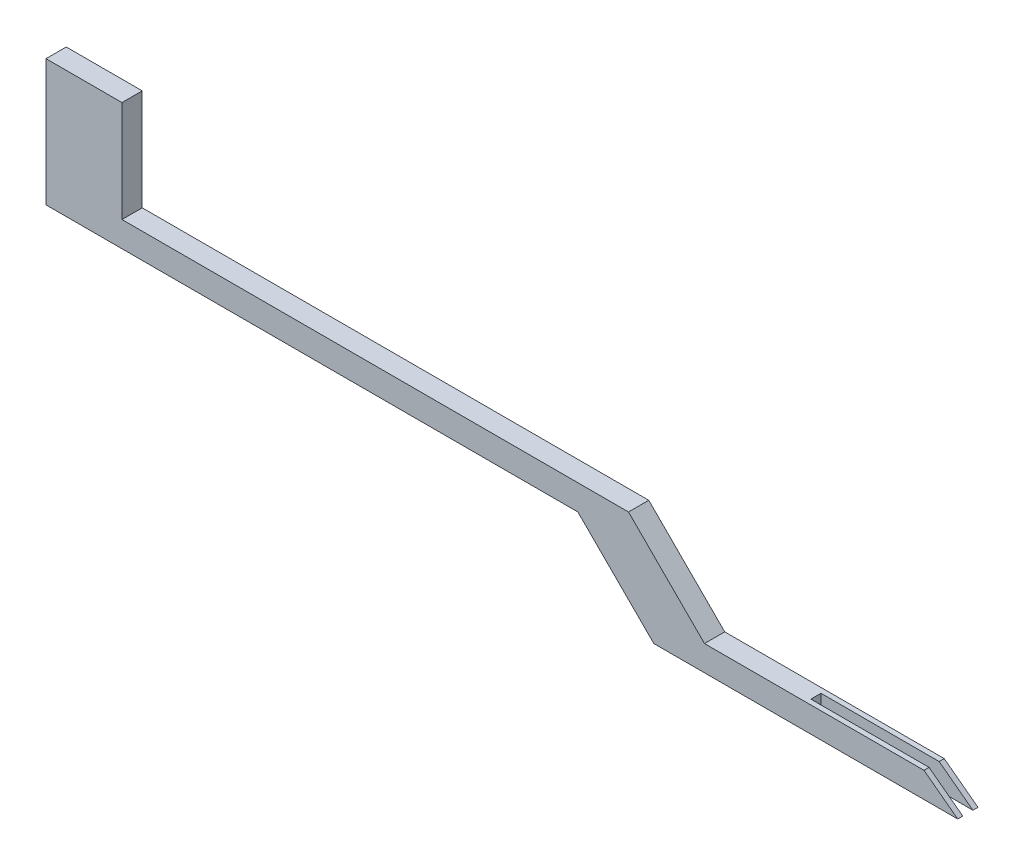
ISO-10303-21;
HEADER;
FILE_DESCRIPTION(('STEP AP214'),'2;1');
FILE_NAME('part.step','',(''),(''),'','','');
FILE_SCHEMA(('AUTOMOTIVE_DESIGN { 1 0 10303 214 1 1 1 1 }'));
ENDSEC;
DATA;
#1=APPLICATION_CONTEXT('core data for automotive mechanical design processes');
#2=APPLICATION_PROTOCOL_DEFINITION('international standard','automotive_design',2000,#1);
#3=PRODUCT_CONTEXT('',#1,'mechanical');
#4=PRODUCT('Part','Part','',(#3));
#5=PRODUCT_RELATED_PRODUCT_CATEGORY('part','',(#4));
#6=PRODUCT_DEFINITION_FORMATION('','',#4);
#7=PRODUCT_DEFINITION_CONTEXT('part definition',#1,'design');
#8=PRODUCT_DEFINITION('design','',#6,#7);
#9=PRODUCT_DEFINITION_SHAPE('','',#8);
#10=(LENGTH_UNIT() NAMED_UNIT(*) SI_UNIT(.MILLI.,.METRE.));
#11=(NAMED_UNIT(*) PLANE_ANGLE_UNIT() SI_UNIT($,.RADIAN.));
#12=(NAMED_UNIT(*) SI_UNIT($,.STERADIAN.) SOLID_ANGLE_UNIT());
#13=UNCERTAINTY_MEASURE_WITH_UNIT(LENGTH_MEASURE(1.E-05),#10,'distance_accuracy_value','');
#14=(GEOMETRIC_REPRESENTATION_CONTEXT(3) GLOBAL_UNCERTAINTY_ASSIGNED_CONTEXT((#13)) GLOBAL_UNIT_ASSIGNED_CONTEXT((#10,
#11,#12)) REPRESENTATION_CONTEXT('',''));
#15=CARTESIAN_POINT('',(0.,0.,0.));
#16=DIRECTION('',(0.,0.,1.));
#17=DIRECTION('',(1.,0.,0.));
#18=AXIS2_PLACEMENT_3D('',#15,#16,#17);
#19=CARTESIAN_POINT('',(17.333333334,-1.,0.4));
#20=DIRECTION('',(-0.600000000383998,-0.799999999712002,0.));
#21=DIRECTION('',(0.799999999712002,-0.600000000383998,0.));
#22=AXIS2_PLACEMENT_3D('',#19,#20,#21);
#23=PLANE('',#22);
#24=DIRECTION('',(0.,0.,-1.));
#25=VECTOR('',#24,1.);
#26=CARTESIAN_POINT('',(18.,-1.5,0.4));
#27=LINE('',#26,#25);
#28=CARTESIAN_POINT('',(18.,-1.5,0.4));
#29=VERTEX_POINT('',#28);
#30=CARTESIAN_POINT('',(18.,-1.5,0.3));
#31=VERTEX_POINT('',#30);
#32=EDGE_CURVE('E217',#29,#31,#27,.T.);
#33=ORIENTED_EDGE('',*,*,#32,.T.);
#34=DIRECTION('',(-0.799999999712002,0.600000000383998,0.));
#35=VECTOR('',#34,1.);
#36=CARTESIAN_POINT('',(17.333333334,-1.,0.3));
#37=LINE('',#36,#35);
#38=CARTESIAN_POINT('',(17.333333334,-1.,0.3));
#39=VERTEX_POINT('',#38);
#40=EDGE_CURVE('E276',#31,#39,#37,.T.);
#41=ORIENTED_EDGE('',*,*,#40,.T.);
#42=DIRECTION('',(0.,0.,-1.));
#43=VECTOR('',#42,1.);
#44=CARTESIAN_POINT('',(17.333333334,-1.,0.4));
#45=LINE('',#44,#43);
#46=CARTESIAN_POINT('',(17.333333334,-1.,0.4));
#47=VERTEX_POINT('',#46);
#48=EDGE_CURVE('E212',#47,#39,#45,.T.);
#49=ORIENTED_EDGE('',*,*,#48,.F.);
#50=DIRECTION('',(-0.799999999712002,0.600000000383998,0.));
#51=VECTOR('',#50,1.);
#52=CARTESIAN_POINT('',(17.333333334,-1.,0.4));
#53=LINE('',#52,#51);
#54=EDGE_CURVE('E247',#29,#47,#53,.T.);
#55=ORIENTED_EDGE('',*,*,#54,.F.);
#56=EDGE_LOOP('',(#33,#41,#49,#55));
#57=FACE_BOUND('',#56,.T.);
#58=ADVANCED_FACE('F39',(#57),#23,.F.);
#59=CARTESIAN_POINT('',(10.5,0.,0.4));
#60=DIRECTION('',(0.,1.,0.));
#61=DIRECTION('',(-1.,0.,0.));
#62=AXIS2_PLACEMENT_3D('',#59,#60,#61);
#63=PLANE('',#62);
#64=DIRECTION('',(1.,0.,0.));
#65=VECTOR('',#64,1.);
#66=CARTESIAN_POINT('',(10.5,0.,0.));
#67=LINE('',#66,#65);
#68=CARTESIAN_POINT('',(0.,0.,0.));
#69=VERTEX_POINT('',#68);
#70=CARTESIAN_POINT('',(10.5,0.,0.));
#71=VERTEX_POINT('',#70);
#72=EDGE_CURVE('E164',#69,#71,#67,.T.);
#73=ORIENTED_EDGE('',*,*,#72,.T.);
#74=DIRECTION('',(0.,0.,-1.));
#75=VECTOR('',#74,1.);
#76=CARTESIAN_POINT('',(10.5,0.,0.4));
#77=LINE('',#76,#75);
#78=CARTESIAN_POINT('',(10.5,0.,0.4));
#79=VERTEX_POINT('',#78);
#80=EDGE_CURVE('E48',#79,#71,#77,.T.);
#81=ORIENTED_EDGE('',*,*,#80,.F.);
#82=DIRECTION('',(1.,0.,0.));
#83=VECTOR('',#82,1.);
#84=CARTESIAN_POINT('',(10.5,0.,0.4));
#85=LINE('',#84,#83);
#86=CARTESIAN_POINT('',(0.,0.,0.4));
#87=VERTEX_POINT('',#86);
#88=EDGE_CURVE('E196',#87,#79,#85,.T.);
#89=ORIENTED_EDGE('',*,*,#88,.F.);
#90=DIRECTION('',(0.,0.,-1.));
#91=VECTOR('',#90,1.);
#92=CARTESIAN_POINT('',(0.,0.,0.4));
#93=LINE('',#92,#91);
#94=EDGE_CURVE('E160',#87,#69,#93,.T.);
#95=ORIENTED_EDGE('',*,*,#94,.T.);
#96=EDGE_LOOP('',(#73,#81,#89,#95));
#97=FACE_BOUND('',#96,.T.);
#98=ADVANCED_FACE('F41',(#97),#63,.F.);
#99=CARTESIAN_POINT('',(12.,-1.5,0.4));
#100=DIRECTION('',(0.70710678118655,0.707106781186545,0.));
#101=DIRECTION('',(-0.707106781186545,0.70710678118655,0.));
#102=AXIS2_PLACEMENT_3D('',#99,#100,#101);
#103=PLANE('',#102);
#104=DIRECTION('',(0.707106781186545,-0.70710678118655,0.));
#105=VECTOR('',#104,1.);
#106=CARTESIAN_POINT('',(12.,-1.5,0.));
#107=LINE('',#106,#105);
#108=CARTESIAN_POINT('',(12.,-1.5,0.));
#109=VERTEX_POINT('',#108);
#110=EDGE_CURVE('E168',#71,#109,#107,.T.);
#111=ORIENTED_EDGE('',*,*,#110,.T.);
#112=DIRECTION('',(0.,0.,-1.));
#113=VECTOR('',#112,1.);
#114=CARTESIAN_POINT('',(12.,-1.5,0.4));
#115=LINE('',#114,#113);
#116=CARTESIAN_POINT('',(12.,-1.5,0.4));
#117=VERTEX_POINT('',#116);
#118=EDGE_CURVE('E221',#117,#109,#115,.T.);
#119=ORIENTED_EDGE('',*,*,#118,.F.);
#120=DIRECTION('',(0.707106781186545,-0.70710678118655,0.));
#121=VECTOR('',#120,1.);
#122=CARTESIAN_POINT('',(12.,-1.5,0.4));
#123=LINE('',#122,#121);
#124=EDGE_CURVE('E111',#79,#117,#123,.T.);
#125=ORIENTED_EDGE('',*,*,#124,.F.);
#126=ORIENTED_EDGE('',*,*,#80,.T.);
#127=EDGE_LOOP('',(#111,#119,#125,#126));
#128=FACE_BOUND('',#127,.T.);
#129=ADVANCED_FACE('F226',(#128),#103,.F.);
#130=CARTESIAN_POINT('',(18.,-1.5,0.4));
#131=DIRECTION('',(0.,1.,0.));
#132=DIRECTION('',(-1.,0.,0.));
#133=AXIS2_PLACEMENT_3D('',#130,#131,#132);
#134=PLANE('',#133);
#135=DIRECTION('',(0.,0.,1.));
#136=VECTOR('',#135,1.);
#137=CARTESIAN_POINT('',(15.,-1.5,0.4));
#138=LINE('',#137,#136);
#139=CARTESIAN_POINT('',(15.,-1.5,0.1));
#140=VERTEX_POINT('',#139);
#141=CARTESIAN_POINT('',(15.,-1.5,0.3));
#142=VERTEX_POINT('',#141);
#143=EDGE_CURVE('E280',#140,#142,#138,.T.);
#144=ORIENTED_EDGE('',*,*,#143,.T.);
#145=DIRECTION('',(1.,0.,0.));
#146=VECTOR('',#145,1.);
#147=CARTESIAN_POINT('',(18.,-1.5,0.3));
#148=LINE('',#147,#146);
#149=EDGE_CURVE('E169',#142,#31,#148,.T.);
#150=ORIENTED_EDGE('',*,*,#149,.T.);
#151=ORIENTED_EDGE('',*,*,#32,.F.);
#152=DIRECTION('',(1.,0.,0.));
#153=VECTOR('',#152,1.);
#154=CARTESIAN_POINT('',(18.,-1.5,0.4));
#155=LINE('',#154,#153);
#156=EDGE_CURVE('E243',#117,#29,#155,.T.);
#157=ORIENTED_EDGE('',*,*,#156,.F.);
#158=ORIENTED_EDGE('',*,*,#118,.T.);
#159=DIRECTION('',(1.,0.,0.));
#160=VECTOR('',#159,1.);
#161=CARTESIAN_POINT('',(18.,-1.5,0.));
#162=LINE('',#161,#160);
#163=CARTESIAN_POINT('',(18.,-1.5,0.));
#164=VERTEX_POINT('',#163);
#165=EDGE_CURVE('E172',#109,#164,#162,.T.);
#166=ORIENTED_EDGE('',*,*,#165,.T.);
#167=CARTESIAN_POINT('',(18.,-1.5,0.1));
#168=VERTEX_POINT('',#167);
#169=EDGE_CURVE('E216',#168,#164,#27,.T.);
#170=ORIENTED_EDGE('',*,*,#169,.F.);
#171=DIRECTION('',(-1.,0.,0.));
#172=VECTOR('',#171,1.);
#173=CARTESIAN_POINT('',(18.,-1.5,0.1));
#174=LINE('',#173,#172);
#175=EDGE_CURVE('E283',#168,#140,#174,.T.);
#176=ORIENTED_EDGE('',*,*,#175,.T.);
#177=EDGE_LOOP('',(#144,#150,#151,#157,#158,#166,#170,#176));
#178=FACE_BOUND('',#177,.T.);
#179=ADVANCED_FACE('F238',(#178),#134,.F.);
#180=CARTESIAN_POINT('',(17.333333334,-1.,0.1));
#181=VERTEX_POINT('',#180);
#182=CARTESIAN_POINT('',(17.333333334,-1.,0.));
#183=VERTEX_POINT('',#182);
#184=EDGE_CURVE('E211',#181,#183,#45,.T.);
#185=ORIENTED_EDGE('',*,*,#184,.F.);
#186=DIRECTION('',(0.799999999712002,-0.600000000383998,0.));
#187=VECTOR('',#186,1.);
#188=CARTESIAN_POINT('',(17.333333334,-1.,0.1));
#189=LINE('',#188,#187);
#190=EDGE_CURVE('E55',#181,#168,#189,.T.);
#191=ORIENTED_EDGE('',*,*,#190,.T.);
#192=ORIENTED_EDGE('',*,*,#169,.T.);
#193=DIRECTION('',(-0.799999999712002,0.600000000383998,0.));
#194=VECTOR('',#193,1.);
#195=CARTESIAN_POINT('',(17.333333334,-1.,0.));
#196=LINE('',#195,#194);
#197=EDGE_CURVE('E176',#164,#183,#196,.T.);
#198=ORIENTED_EDGE('',*,*,#197,.T.);
#199=EDGE_LOOP('',(#185,#191,#192,#198));
#200=FACE_BOUND('',#199,.T.);
#201=ADVANCED_FACE('F326',(#200),#23,.F.);
#202=CARTESIAN_POINT('',(13.,-1.,0.4));
#203=DIRECTION('',(0.,-1.,0.));
#204=DIRECTION('',(0.,0.,-1.));
#205=AXIS2_PLACEMENT_3D('',#202,#203,#204);
#206=PLANE('',#205);
#207=ORIENTED_EDGE('',*,*,#48,.T.);
#208=DIRECTION('',(1.,0.,0.));
#209=VECTOR('',#208,1.);
#210=CARTESIAN_POINT('',(18.,-1.,0.3));
#211=LINE('',#210,#209);
#212=CARTESIAN_POINT('',(15.,-1.,0.3));
#213=VERTEX_POINT('',#212);
#214=EDGE_CURVE('E293',#213,#39,#211,.T.);
#215=ORIENTED_EDGE('',*,*,#214,.F.);
#216=DIRECTION('',(0.,0.,1.));
#217=VECTOR('',#216,1.);
#218=CARTESIAN_POINT('',(15.,-1.,0.1));
#219=LINE('',#218,#217);
#220=CARTESIAN_POINT('',(15.,-1.,0.1));
#221=VERTEX_POINT('',#220);
#222=EDGE_CURVE('E300',#221,#213,#219,.T.);
#223=ORIENTED_EDGE('',*,*,#222,.F.);
#224=DIRECTION('',(1.,0.,0.));
#225=VECTOR('',#224,1.);
#226=CARTESIAN_POINT('',(13.,-1.,0.100000000000001));
#227=LINE('',#226,#225);
#228=EDGE_CURVE('E11',#221,#181,#227,.T.);
#229=ORIENTED_EDGE('',*,*,#228,.T.);
#230=ORIENTED_EDGE('',*,*,#184,.T.);
#231=DIRECTION('',(-1.,0.,0.));
#232=VECTOR('',#231,1.);
#233=CARTESIAN_POINT('',(13.,-1.,0.));
#234=LINE('',#233,#232);
#235=CARTESIAN_POINT('',(13.,-1.,0.));
#236=VERTEX_POINT('',#235);
#237=EDGE_CURVE('E180',#183,#236,#234,.T.);
#238=ORIENTED_EDGE('',*,*,#237,.T.);
#239=DIRECTION('',(0.,0.,-1.));
#240=VECTOR('',#239,1.);
#241=CARTESIAN_POINT('',(13.,-1.,0.4));
#242=LINE('',#241,#240);
#243=CARTESIAN_POINT('',(13.,-1.,0.4));
#244=VERTEX_POINT('',#243);
#245=EDGE_CURVE('E207',#244,#236,#242,.T.);
#246=ORIENTED_EDGE('',*,*,#245,.F.);
#247=DIRECTION('',(-1.,0.,0.));
#248=VECTOR('',#247,1.);
#249=CARTESIAN_POINT('',(13.,-1.,0.4));
#250=LINE('',#249,#248);
#251=EDGE_CURVE('E251',#47,#244,#250,.T.);
#252=ORIENTED_EDGE('',*,*,#251,.F.);
#253=EDGE_LOOP('',(#207,#215,#223,#229,#230,#238,#246,#252));
#254=FACE_BOUND('',#253,.T.);
#255=ADVANCED_FACE('F315',(#254),#206,.F.);
#256=CARTESIAN_POINT('',(11.5,0.499999999999999,0.4));
#257=DIRECTION('',(-0.707106781186549,-0.707106781186546,0.));
#258=DIRECTION('',(0.707106781186546,-0.707106781186549,0.));
#259=AXIS2_PLACEMENT_3D('',#256,#257,#258);
#260=PLANE('',#259);
#261=DIRECTION('',(-0.707106781186546,0.707106781186549,0.));
#262=VECTOR('',#261,1.);
#263=CARTESIAN_POINT('',(11.5,0.499999999999999,0.));
#264=LINE('',#263,#262);
#265=CARTESIAN_POINT('',(11.5,0.499999999999999,0.));
#266=VERTEX_POINT('',#265);
#267=EDGE_CURVE('E183',#236,#266,#264,.T.);
#268=ORIENTED_EDGE('',*,*,#267,.T.);
#269=DIRECTION('',(0.,0.,-1.));
#270=VECTOR('',#269,1.);
#271=CARTESIAN_POINT('',(11.5,0.499999999999999,0.4));
#272=LINE('',#271,#270);
#273=CARTESIAN_POINT('',(11.5,0.499999999999999,0.4));
#274=VERTEX_POINT('',#273);
#275=EDGE_CURVE('E203',#274,#266,#272,.T.);
#276=ORIENTED_EDGE('',*,*,#275,.F.);
#277=DIRECTION('',(-0.707106781186546,0.707106781186549,0.));
#278=VECTOR('',#277,1.);
#279=CARTESIAN_POINT('',(11.5,0.499999999999999,0.4));
#280=LINE('',#279,#278);
#281=EDGE_CURVE('E258',#244,#274,#280,.T.);
#282=ORIENTED_EDGE('',*,*,#281,.F.);
#283=ORIENTED_EDGE('',*,*,#245,.T.);
#284=EDGE_LOOP('',(#268,#276,#282,#283));
#285=FACE_BOUND('',#284,.T.);
#286=ADVANCED_FACE('F266',(#285),#260,.F.);
#287=CARTESIAN_POINT('',(1.5,0.499999999999999,0.4));
#288=DIRECTION('',(0.,-1.,0.));
#289=DIRECTION('',(1.,0.,0.));
#290=AXIS2_PLACEMENT_3D('',#287,#288,#289);
#291=PLANE('',#290);
#292=DIRECTION('',(-1.,0.,0.));
#293=VECTOR('',#292,1.);
#294=CARTESIAN_POINT('',(1.5,0.499999999999999,0.));
#295=LINE('',#294,#293);
#296=CARTESIAN_POINT('',(1.5,0.499999999999999,0.));
#297=VERTEX_POINT('',#296);
#298=EDGE_CURVE('E186',#266,#297,#295,.T.);
#299=ORIENTED_EDGE('',*,*,#298,.T.);
#300=DIRECTION('',(0.,0.,-1.));
#301=VECTOR('',#300,1.);
#302=CARTESIAN_POINT('',(1.5,0.499999999999999,0.4));
#303=LINE('',#302,#301);
#304=CARTESIAN_POINT('',(1.5,0.499999999999999,0.4));
#305=VERTEX_POINT('',#304);
#306=EDGE_CURVE('E153',#305,#297,#303,.T.);
#307=ORIENTED_EDGE('',*,*,#306,.F.);
#308=DIRECTION('',(-1.,0.,0.));
#309=VECTOR('',#308,1.);
#310=CARTESIAN_POINT('',(1.5,0.499999999999999,0.4));
#311=LINE('',#310,#309);
#312=EDGE_CURVE('E139',#274,#305,#311,.T.);
#313=ORIENTED_EDGE('',*,*,#312,.F.);
#314=ORIENTED_EDGE('',*,*,#275,.T.);
#315=EDGE_LOOP('',(#299,#307,#313,#314));
#316=FACE_BOUND('',#315,.T.);
#317=ADVANCED_FACE('F270',(#316),#291,.F.);
#318=CARTESIAN_POINT('',(1.5,2.5,0.4));
#319=DIRECTION('',(-1.,0.,0.));
#320=DIRECTION('',(0.,-1.,0.));
#321=AXIS2_PLACEMENT_3D('',#318,#319,#320);
#322=PLANE('',#321);
#323=DIRECTION('',(0.,1.,0.));
#324=VECTOR('',#323,1.);
#325=CARTESIAN_POINT('',(1.5,2.5,0.));
#326=LINE('',#325,#324);
#327=CARTESIAN_POINT('',(1.5,2.5,0.));
#328=VERTEX_POINT('',#327);
#329=EDGE_CURVE('E149',#297,#328,#326,.T.);
#330=ORIENTED_EDGE('',*,*,#329,.T.);
#331=DIRECTION('',(0.,0.,-1.));
#332=VECTOR('',#331,1.);
#333=CARTESIAN_POINT('',(1.5,2.5,0.4));
#334=LINE('',#333,#332);
#335=CARTESIAN_POINT('',(1.5,2.5,0.4));
#336=VERTEX_POINT('',#335);
#337=EDGE_CURVE('E146',#336,#328,#334,.T.);
#338=ORIENTED_EDGE('',*,*,#337,.F.);
#339=DIRECTION('',(0.,1.,0.));
#340=VECTOR('',#339,1.);
#341=CARTESIAN_POINT('',(1.5,2.5,0.4));
#342=LINE('',#341,#340);
#343=EDGE_CURVE('E132',#305,#336,#342,.T.);
#344=ORIENTED_EDGE('',*,*,#343,.F.);
#345=ORIENTED_EDGE('',*,*,#306,.T.);
#346=EDGE_LOOP('',(#330,#338,#344,#345));
#347=FACE_BOUND('',#346,.T.);
#348=ADVANCED_FACE('F147',(#347),#322,.F.);
#349=CARTESIAN_POINT('',(0.,2.5,0.4));
#350=DIRECTION('',(0.,-1.,0.));
#351=DIRECTION('',(0.,0.,-1.));
#352=AXIS2_PLACEMENT_3D('',#349,#350,#351);
#353=PLANE('',#352);
#354=DIRECTION('',(-1.,0.,0.));
#355=VECTOR('',#354,1.);
#356=CARTESIAN_POINT('',(0.,2.5,0.));
#357=LINE('',#356,#355);
#358=CARTESIAN_POINT('',(0.,2.5,0.));
#359=VERTEX_POINT('',#358);
#360=EDGE_CURVE('E191',#328,#359,#357,.T.);
#361=ORIENTED_EDGE('',*,*,#360,.T.);
#362=DIRECTION('',(0.,0.,-1.));
#363=VECTOR('',#362,1.);
#364=CARTESIAN_POINT('',(0.,2.5,0.4));
#365=LINE('',#364,#363);
#366=CARTESIAN_POINT('',(0.,2.5,0.4));
#367=VERTEX_POINT('',#366);
#368=EDGE_CURVE('E154',#367,#359,#365,.T.);
#369=ORIENTED_EDGE('',*,*,#368,.F.);
#370=DIRECTION('',(-1.,0.,0.));
#371=VECTOR('',#370,1.);
#372=CARTESIAN_POINT('',(0.,2.5,0.4));
#373=LINE('',#372,#371);
#374=EDGE_CURVE('E136',#336,#367,#373,.T.);
#375=ORIENTED_EDGE('',*,*,#374,.F.);
#376=ORIENTED_EDGE('',*,*,#337,.T.);
#377=EDGE_LOOP('',(#361,#369,#375,#376));
#378=FACE_BOUND('',#377,.T.);
#379=ADVANCED_FACE('F156',(#378),#353,.F.);
#380=CARTESIAN_POINT('',(0.,0.,0.4));
#381=DIRECTION('',(1.,0.,0.));
#382=DIRECTION('',(0.,0.,-1.));
#383=AXIS2_PLACEMENT_3D('',#380,#381,#382);
#384=PLANE('',#383);
#385=DIRECTION('',(0.,-1.,0.));
#386=VECTOR('',#385,1.);
#387=CARTESIAN_POINT('',(0.,0.,0.));
#388=LINE('',#387,#386);
#389=EDGE_CURVE('E102',#359,#69,#388,.T.);
#390=ORIENTED_EDGE('',*,*,#389,.T.);
#391=ORIENTED_EDGE('',*,*,#94,.F.);
#392=DIRECTION('',(0.,-1.,0.));
#393=VECTOR('',#392,1.);
#394=CARTESIAN_POINT('',(0.,0.,0.4));
#395=LINE('',#394,#393);
#396=EDGE_CURVE('E63',#367,#87,#395,.T.);
#397=ORIENTED_EDGE('',*,*,#396,.F.);
#398=ORIENTED_EDGE('',*,*,#368,.T.);
#399=EDGE_LOOP('',(#390,#391,#397,#398));
#400=FACE_BOUND('',#399,.T.);
#401=ADVANCED_FACE('F271',(#400),#384,.F.);
#402=CARTESIAN_POINT('',(0.,0.,0.4));
#403=DIRECTION('',(0.,0.,-1.));
#404=DIRECTION('',(-1.,0.,0.));
#405=AXIS2_PLACEMENT_3D('',#402,#403,#404);
#406=PLANE('',#405);
#407=ORIENTED_EDGE('',*,*,#88,.T.);
#408=ORIENTED_EDGE('',*,*,#124,.T.);
#409=ORIENTED_EDGE('',*,*,#156,.T.);
#410=ORIENTED_EDGE('',*,*,#54,.T.);
#411=ORIENTED_EDGE('',*,*,#251,.T.);
#412=ORIENTED_EDGE('',*,*,#281,.T.);
#413=ORIENTED_EDGE('',*,*,#312,.T.);
#414=ORIENTED_EDGE('',*,*,#343,.T.);
#415=ORIENTED_EDGE('',*,*,#374,.T.);
#416=ORIENTED_EDGE('',*,*,#396,.T.);
#417=EDGE_LOOP('',(#407,#408,#409,#410,#411,#412,#413,#414,#415,#416));
#418=FACE_BOUND('',#417,.T.);
#419=ADVANCED_FACE('F134',(#418),#406,.F.);
#420=CARTESIAN_POINT('',(0.,0.,0.));
#421=DIRECTION('',(0.,0.,-1.));
#422=DIRECTION('',(-1.,0.,0.));
#423=AXIS2_PLACEMENT_3D('',#420,#421,#422);
#424=PLANE('',#423);
#425=ORIENTED_EDGE('',*,*,#72,.F.);
#426=ORIENTED_EDGE('',*,*,#389,.F.);
#427=ORIENTED_EDGE('',*,*,#360,.F.);
#428=ORIENTED_EDGE('',*,*,#329,.F.);
#429=ORIENTED_EDGE('',*,*,#298,.F.);
#430=ORIENTED_EDGE('',*,*,#267,.F.);
#431=ORIENTED_EDGE('',*,*,#237,.F.);
#432=ORIENTED_EDGE('',*,*,#197,.F.);
#433=ORIENTED_EDGE('',*,*,#165,.F.);
#434=ORIENTED_EDGE('',*,*,#110,.F.);
#435=EDGE_LOOP('',(#425,#426,#427,#428,#429,#430,#431,#432,#433,#434));
#436=FACE_BOUND('',#435,.T.);
#437=ADVANCED_FACE('F231',(#436),#424,.T.);
#438=CARTESIAN_POINT('',(18.,-1.7,0.3));
#439=DIRECTION('',(0.,0.,1.));
#440=DIRECTION('',(1.,0.,0.));
#441=AXIS2_PLACEMENT_3D('',#438,#439,#440);
#442=PLANE('',#441);
#443=DIRECTION('',(0.,1.,0.));
#444=VECTOR('',#443,1.);
#445=CARTESIAN_POINT('',(15.,-1.7,0.3));
#446=LINE('',#445,#444);
#447=EDGE_CURVE('E288',#142,#213,#446,.T.);
#448=ORIENTED_EDGE('',*,*,#447,.T.);
#449=ORIENTED_EDGE('',*,*,#214,.T.);
#450=ORIENTED_EDGE('',*,*,#40,.F.);
#451=ORIENTED_EDGE('',*,*,#149,.F.);
#452=EDGE_LOOP('',(#448,#449,#450,#451));
#453=FACE_BOUND('',#452,.T.);
#454=ADVANCED_FACE('F320',(#453),#442,.F.);
#455=CARTESIAN_POINT('',(15.,-1.7,0.1));
#456=DIRECTION('',(-1.,0.,0.));
#457=DIRECTION('',(0.,0.,1.));
#458=AXIS2_PLACEMENT_3D('',#455,#456,#457);
#459=PLANE('',#458);
#460=DIRECTION('',(0.,1.,0.));
#461=VECTOR('',#460,1.);
#462=CARTESIAN_POINT('',(15.,-1.7,0.1));
#463=LINE('',#462,#461);
#464=EDGE_CURVE('E289',#140,#221,#463,.T.);
#465=ORIENTED_EDGE('',*,*,#464,.T.);
#466=ORIENTED_EDGE('',*,*,#222,.T.);
#467=ORIENTED_EDGE('',*,*,#447,.F.);
#468=ORIENTED_EDGE('',*,*,#143,.F.);
#469=EDGE_LOOP('',(#465,#466,#467,#468));
#470=FACE_BOUND('',#469,.T.);
#471=ADVANCED_FACE('F308',(#470),#459,.F.);
#472=CARTESIAN_POINT('',(18.,-1.7,0.1));
#473=DIRECTION('',(0.,0.,-1.));
#474=DIRECTION('',(-1.,0.,0.));
#475=AXIS2_PLACEMENT_3D('',#472,#473,#474);
#476=PLANE('',#475);
#477=ORIENTED_EDGE('',*,*,#190,.F.);
#478=ORIENTED_EDGE('',*,*,#228,.F.);
#479=ORIENTED_EDGE('',*,*,#464,.F.);
#480=ORIENTED_EDGE('',*,*,#175,.F.);
#481=EDGE_LOOP('',(#477,#478,#479,#480));
#482=FACE_BOUND('',#481,.T.);
#483=ADVANCED_FACE('F333',(#482),#476,.F.);
#484=CLOSED_SHELL('',(#58,#98,#129,#179,#201,#255,#286,#317,#348,#379,#401,#419,#437,#454,#471,#483));
#485=MANIFOLD_SOLID_BREP('B2',#484);
#486=ADVANCED_BREP_SHAPE_REPRESENTATION('',(#18,#485),#14);
#487=SHAPE_DEFINITION_REPRESENTATION(#9,#486);
ENDSEC;
END-ISO-10303-21;
